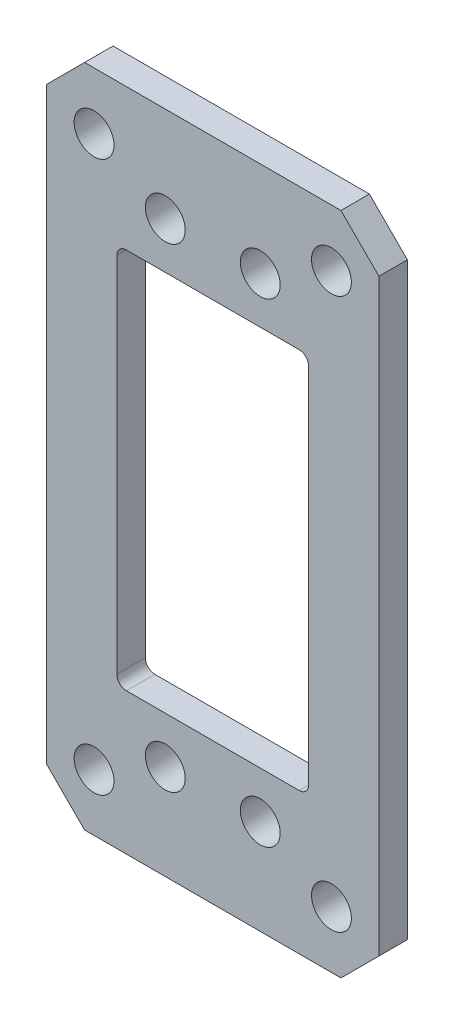
ISO-10303-21;
HEADER;
FILE_DESCRIPTION(('STEP AP214'),'2;1');
FILE_NAME('part.step','',(''),(''),'','','');
FILE_SCHEMA(('AUTOMOTIVE_DESIGN { 1 0 10303 214 1 1 1 1 }'));
ENDSEC;
DATA;
#1=APPLICATION_CONTEXT('core data for automotive mechanical design processes');
#2=APPLICATION_PROTOCOL_DEFINITION('international standard','automotive_design',2000,#1);
#3=PRODUCT_CONTEXT('',#1,'mechanical');
#4=PRODUCT('Part','Part','',(#3));
#5=PRODUCT_RELATED_PRODUCT_CATEGORY('part','',(#4));
#6=PRODUCT_DEFINITION_FORMATION('','',#4);
#7=PRODUCT_DEFINITION_CONTEXT('part definition',#1,'design');
#8=PRODUCT_DEFINITION('design','',#6,#7);
#9=PRODUCT_DEFINITION_SHAPE('','',#8);
#10=(LENGTH_UNIT() NAMED_UNIT(*) SI_UNIT(.MILLI.,.METRE.));
#11=(NAMED_UNIT(*) PLANE_ANGLE_UNIT() SI_UNIT($,.RADIAN.));
#12=(NAMED_UNIT(*) SI_UNIT($,.STERADIAN.) SOLID_ANGLE_UNIT());
#13=UNCERTAINTY_MEASURE_WITH_UNIT(LENGTH_MEASURE(1.E-05),#10,'distance_accuracy_value','');
#14=(GEOMETRIC_REPRESENTATION_CONTEXT(3) GLOBAL_UNCERTAINTY_ASSIGNED_CONTEXT((#13)) GLOBAL_UNIT_ASSIGNED_CONTEXT((#10,
#11,#12)) REPRESENTATION_CONTEXT('',''));
#15=CARTESIAN_POINT('',(0.,0.,0.));
#16=DIRECTION('',(0.,0.,1.));
#17=DIRECTION('',(1.,0.,0.));
#18=AXIS2_PLACEMENT_3D('',#15,#16,#17);
#19=CARTESIAN_POINT('',(5.,25.,0.));
#20=DIRECTION('',(0.,0.,1.));
#21=DIRECTION('',(1.,0.,0.));
#22=AXIS2_PLACEMENT_3D('',#19,#20,#21);
#23=CYLINDRICAL_SURFACE('',#22,2.1);
#24=CARTESIAN_POINT('',(5.,25.,0.));
#25=DIRECTION('',(0.,0.,1.));
#26=DIRECTION('',(1.,0.,0.));
#27=AXIS2_PLACEMENT_3D('',#24,#25,#26);
#28=CIRCLE('',#27,2.1);
#29=CARTESIAN_POINT('',(7.1,25.,0.));
#30=VERTEX_POINT('',#29);
#31=EDGE_CURVE('E221',#30,#30,#28,.T.);
#32=ORIENTED_EDGE('',*,*,#31,.F.);
#33=EDGE_LOOP('',(#32));
#34=FACE_BOUND('',#33,.T.);
#35=CARTESIAN_POINT('',(5.,25.,3.));
#36=DIRECTION('',(0.,0.,-1.));
#37=DIRECTION('',(-1.,0.,0.));
#38=AXIS2_PLACEMENT_3D('',#35,#36,#37);
#39=CIRCLE('',#38,2.1);
#40=CARTESIAN_POINT('',(2.9,25.,3.));
#41=VERTEX_POINT('',#40);
#42=EDGE_CURVE('E224',#41,#41,#39,.T.);
#43=ORIENTED_EDGE('',*,*,#42,.F.);
#44=EDGE_LOOP('',(#43));
#45=FACE_BOUND('',#44,.T.);
#46=ADVANCED_FACE('F39',(#34,#45),#23,.F.);
#47=CARTESIAN_POINT('',(-5.,25.,0.));
#48=DIRECTION('',(0.,0.,1.));
#49=DIRECTION('',(1.,0.,0.));
#50=AXIS2_PLACEMENT_3D('',#47,#48,#49);
#51=CYLINDRICAL_SURFACE('',#50,2.1);
#52=CARTESIAN_POINT('',(-5.,25.,0.));
#53=DIRECTION('',(0.,0.,1.));
#54=DIRECTION('',(1.,0.,0.));
#55=AXIS2_PLACEMENT_3D('',#52,#53,#54);
#56=CIRCLE('',#55,2.1);
#57=CARTESIAN_POINT('',(-2.9,25.,0.));
#58=VERTEX_POINT('',#57);
#59=EDGE_CURVE('E215',#58,#58,#56,.T.);
#60=ORIENTED_EDGE('',*,*,#59,.F.);
#61=EDGE_LOOP('',(#60));
#62=FACE_BOUND('',#61,.T.);
#63=CARTESIAN_POINT('',(-5.,25.,3.));
#64=DIRECTION('',(0.,0.,-1.));
#65=DIRECTION('',(-1.,0.,0.));
#66=AXIS2_PLACEMENT_3D('',#63,#64,#65);
#67=CIRCLE('',#66,2.1);
#68=CARTESIAN_POINT('',(-7.1,25.,3.));
#69=VERTEX_POINT('',#68);
#70=EDGE_CURVE('E218',#69,#69,#67,.T.);
#71=ORIENTED_EDGE('',*,*,#70,.F.);
#72=EDGE_LOOP('',(#71));
#73=FACE_BOUND('',#72,.T.);
#74=ADVANCED_FACE('F328',(#62,#73),#51,.F.);
#75=CARTESIAN_POINT('',(17.5,-35.,3.));
#76=DIRECTION('',(-1.,0.,0.));
#77=DIRECTION('',(0.,0.,1.));
#78=AXIS2_PLACEMENT_3D('',#75,#76,#77);
#79=PLANE('',#78);
#80=DIRECTION('',(0.,1.,0.));
#81=VECTOR('',#80,1.);
#82=CARTESIAN_POINT('',(17.5,-35.,3.));
#83=LINE('',#82,#81);
#84=CARTESIAN_POINT('',(17.5,-31.,3.));
#85=VERTEX_POINT('',#84);
#86=CARTESIAN_POINT('',(17.5,31.,3.));
#87=VERTEX_POINT('',#86);
#88=EDGE_CURVE('E179',#85,#87,#83,.T.);
#89=ORIENTED_EDGE('',*,*,#88,.F.);
#90=DIRECTION('',(0.,0.,-1.));
#91=VECTOR('',#90,1.);
#92=CARTESIAN_POINT('',(17.5,-31.,3.));
#93=LINE('',#92,#91);
#94=CARTESIAN_POINT('',(17.5,-31.,0.));
#95=VERTEX_POINT('',#94);
#96=EDGE_CURVE('E207',#85,#95,#93,.T.);
#97=ORIENTED_EDGE('',*,*,#96,.T.);
#98=DIRECTION('',(0.,1.,0.));
#99=VECTOR('',#98,1.);
#100=CARTESIAN_POINT('',(17.5,-35.,0.));
#101=LINE('',#100,#99);
#102=CARTESIAN_POINT('',(17.5,31.,0.));
#103=VERTEX_POINT('',#102);
#104=EDGE_CURVE('E286',#95,#103,#101,.T.);
#105=ORIENTED_EDGE('',*,*,#104,.T.);
#106=DIRECTION('',(0.,0.,1.));
#107=VECTOR('',#106,1.);
#108=CARTESIAN_POINT('',(17.5,31.,3.));
#109=LINE('',#108,#107);
#110=EDGE_CURVE('E205',#103,#87,#109,.T.);
#111=ORIENTED_EDGE('',*,*,#110,.T.);
#112=EDGE_LOOP('',(#89,#97,#105,#111));
#113=FACE_BOUND('',#112,.T.);
#114=ADVANCED_FACE('F325',(#113),#79,.F.);
#115=CARTESIAN_POINT('',(-17.5,35.,3.));
#116=DIRECTION('',(0.,-1.,0.));
#117=DIRECTION('',(0.,0.,-1.));
#118=AXIS2_PLACEMENT_3D('',#115,#116,#117);
#119=PLANE('',#118);
#120=DIRECTION('',(-1.,0.,0.));
#121=VECTOR('',#120,1.);
#122=CARTESIAN_POINT('',(-17.5,35.,3.));
#123=LINE('',#122,#121);
#124=CARTESIAN_POINT('',(13.5,35.,3.));
#125=VERTEX_POINT('',#124);
#126=CARTESIAN_POINT('',(-13.5,35.,3.));
#127=VERTEX_POINT('',#126);
#128=EDGE_CURVE('E183',#125,#127,#123,.T.);
#129=ORIENTED_EDGE('',*,*,#128,.F.);
#130=DIRECTION('',(0.,0.,-1.));
#131=VECTOR('',#130,1.);
#132=CARTESIAN_POINT('',(13.5,35.,3.));
#133=LINE('',#132,#131);
#134=CARTESIAN_POINT('',(13.5,35.,0.));
#135=VERTEX_POINT('',#134);
#136=EDGE_CURVE('E212',#125,#135,#133,.T.);
#137=ORIENTED_EDGE('',*,*,#136,.T.);
#138=DIRECTION('',(-1.,0.,0.));
#139=VECTOR('',#138,1.);
#140=CARTESIAN_POINT('',(-17.5,35.,0.));
#141=LINE('',#140,#139);
#142=CARTESIAN_POINT('',(-13.5,35.,0.));
#143=VERTEX_POINT('',#142);
#144=EDGE_CURVE('E185',#135,#143,#141,.T.);
#145=ORIENTED_EDGE('',*,*,#144,.T.);
#146=DIRECTION('',(0.,0.,1.));
#147=VECTOR('',#146,1.);
#148=CARTESIAN_POINT('',(-13.5,35.,3.));
#149=LINE('',#148,#147);
#150=EDGE_CURVE('E210',#143,#127,#149,.T.);
#151=ORIENTED_EDGE('',*,*,#150,.T.);
#152=EDGE_LOOP('',(#129,#137,#145,#151));
#153=FACE_BOUND('',#152,.T.);
#154=ADVANCED_FACE('F306',(#153),#119,.F.);
#155=CARTESIAN_POINT('',(-17.5,-35.,3.));
#156=DIRECTION('',(1.,0.,0.));
#157=DIRECTION('',(0.,0.,-1.));
#158=AXIS2_PLACEMENT_3D('',#155,#156,#157);
#159=PLANE('',#158);
#160=DIRECTION('',(0.,-1.,0.));
#161=VECTOR('',#160,1.);
#162=CARTESIAN_POINT('',(-17.5,-35.,0.));
#163=LINE('',#162,#161);
#164=CARTESIAN_POINT('',(-17.5,31.,0.));
#165=VERTEX_POINT('',#164);
#166=CARTESIAN_POINT('',(-17.5,-31.,0.));
#167=VERTEX_POINT('',#166);
#168=EDGE_CURVE('E180',#165,#167,#163,.T.);
#169=ORIENTED_EDGE('',*,*,#168,.T.);
#170=DIRECTION('',(0.,0.,1.));
#171=VECTOR('',#170,1.);
#172=CARTESIAN_POINT('',(-17.5,-31.,3.));
#173=LINE('',#172,#171);
#174=CARTESIAN_POINT('',(-17.5,-31.,3.));
#175=VERTEX_POINT('',#174);
#176=EDGE_CURVE('E157',#167,#175,#173,.T.);
#177=ORIENTED_EDGE('',*,*,#176,.T.);
#178=DIRECTION('',(0.,-1.,0.));
#179=VECTOR('',#178,1.);
#180=CARTESIAN_POINT('',(-17.5,-35.,3.));
#181=LINE('',#180,#179);
#182=CARTESIAN_POINT('',(-17.5,31.,3.));
#183=VERTEX_POINT('',#182);
#184=EDGE_CURVE('E296',#183,#175,#181,.T.);
#185=ORIENTED_EDGE('',*,*,#184,.F.);
#186=DIRECTION('',(0.,0.,-1.));
#187=VECTOR('',#186,1.);
#188=CARTESIAN_POINT('',(-17.5,31.,3.));
#189=LINE('',#188,#187);
#190=EDGE_CURVE('E162',#183,#165,#189,.T.);
#191=ORIENTED_EDGE('',*,*,#190,.T.);
#192=EDGE_LOOP('',(#169,#177,#185,#191));
#193=FACE_BOUND('',#192,.T.);
#194=ADVANCED_FACE('F317',(#193),#159,.F.);
#195=CARTESIAN_POINT('',(-17.5,-35.,3.));
#196=DIRECTION('',(0.,1.,0.));
#197=DIRECTION('',(0.,0.,1.));
#198=AXIS2_PLACEMENT_3D('',#195,#196,#197);
#199=PLANE('',#198);
#200=DIRECTION('',(1.,0.,0.));
#201=VECTOR('',#200,1.);
#202=CARTESIAN_POINT('',(-17.5,-35.,3.));
#203=LINE('',#202,#201);
#204=CARTESIAN_POINT('',(-13.5,-35.,3.));
#205=VERTEX_POINT('',#204);
#206=CARTESIAN_POINT('',(13.5,-35.,3.));
#207=VERTEX_POINT('',#206);
#208=EDGE_CURVE('E172',#205,#207,#203,.T.);
#209=ORIENTED_EDGE('',*,*,#208,.F.);
#210=DIRECTION('',(0.,0.,-1.));
#211=VECTOR('',#210,1.);
#212=CARTESIAN_POINT('',(-13.5,-35.,3.));
#213=LINE('',#212,#211);
#214=CARTESIAN_POINT('',(-13.5,-35.,0.));
#215=VERTEX_POINT('',#214);
#216=EDGE_CURVE('E156',#205,#215,#213,.T.);
#217=ORIENTED_EDGE('',*,*,#216,.T.);
#218=DIRECTION('',(1.,0.,0.));
#219=VECTOR('',#218,1.);
#220=CARTESIAN_POINT('',(-17.5,-35.,0.));
#221=LINE('',#220,#219);
#222=CARTESIAN_POINT('',(13.5,-35.,0.));
#223=VERTEX_POINT('',#222);
#224=EDGE_CURVE('E169',#215,#223,#221,.T.);
#225=ORIENTED_EDGE('',*,*,#224,.T.);
#226=DIRECTION('',(0.,0.,1.));
#227=VECTOR('',#226,1.);
#228=CARTESIAN_POINT('',(13.5,-35.,3.));
#229=LINE('',#228,#227);
#230=EDGE_CURVE('E174',#223,#207,#229,.T.);
#231=ORIENTED_EDGE('',*,*,#230,.T.);
#232=EDGE_LOOP('',(#209,#217,#225,#231));
#233=FACE_BOUND('',#232,.T.);
#234=ADVANCED_FACE('F168',(#233),#199,.F.);
#235=CARTESIAN_POINT('',(0.,0.,3.));
#236=DIRECTION('',(0.,0.,-1.));
#237=DIRECTION('',(-1.,0.,0.));
#238=AXIS2_PLACEMENT_3D('',#235,#236,#237);
#239=PLANE('',#238);
#240=CARTESIAN_POINT('',(5.,-25.,3.));
#241=DIRECTION('',(0.,0.,-1.));
#242=DIRECTION('',(-1.,0.,0.));
#243=AXIS2_PLACEMENT_3D('',#240,#241,#242);
#244=CIRCLE('',#243,2.1);
#245=CARTESIAN_POINT('',(2.9,-25.,3.));
#246=VERTEX_POINT('',#245);
#247=EDGE_CURVE('E435',#246,#246,#244,.T.);
#248=ORIENTED_EDGE('',*,*,#247,.T.);
#249=EDGE_LOOP('',(#248));
#250=FACE_BOUND('',#249,.T.);
#251=CARTESIAN_POINT('',(-5.,-25.,3.));
#252=DIRECTION('',(0.,0.,-1.));
#253=DIRECTION('',(-1.,0.,0.));
#254=AXIS2_PLACEMENT_3D('',#251,#252,#253);
#255=CIRCLE('',#254,2.1);
#256=CARTESIAN_POINT('',(-7.1,-25.,3.));
#257=VERTEX_POINT('',#256);
#258=EDGE_CURVE('E424',#257,#257,#255,.T.);
#259=ORIENTED_EDGE('',*,*,#258,.T.);
#260=EDGE_LOOP('',(#259));
#261=FACE_BOUND('',#260,.T.);
#262=CARTESIAN_POINT('',(12.5,-29.,3.));
#263=DIRECTION('',(0.,0.,-1.));
#264=DIRECTION('',(-1.,0.,0.));
#265=AXIS2_PLACEMENT_3D('',#262,#263,#264);
#266=CIRCLE('',#265,2.1);
#267=CARTESIAN_POINT('',(10.4,-29.,3.));
#268=VERTEX_POINT('',#267);
#269=EDGE_CURVE('E416',#268,#268,#266,.T.);
#270=ORIENTED_EDGE('',*,*,#269,.T.);
#271=EDGE_LOOP('',(#270));
#272=FACE_BOUND('',#271,.T.);
#273=CARTESIAN_POINT('',(-12.5,29.,3.));
#274=DIRECTION('',(0.,0.,-1.));
#275=DIRECTION('',(-1.,0.,0.));
#276=AXIS2_PLACEMENT_3D('',#273,#274,#275);
#277=CIRCLE('',#276,2.1);
#278=CARTESIAN_POINT('',(-14.6,29.,3.));
#279=VERTEX_POINT('',#278);
#280=EDGE_CURVE('E428',#279,#279,#277,.T.);
#281=ORIENTED_EDGE('',*,*,#280,.T.);
#282=EDGE_LOOP('',(#281));
#283=FACE_BOUND('',#282,.T.);
#284=CARTESIAN_POINT('',(-12.5,-29.,3.));
#285=DIRECTION('',(0.,0.,-1.));
#286=DIRECTION('',(-1.,0.,0.));
#287=AXIS2_PLACEMENT_3D('',#284,#285,#286);
#288=CIRCLE('',#287,2.1);
#289=CARTESIAN_POINT('',(-14.6,-29.,3.));
#290=VERTEX_POINT('',#289);
#291=EDGE_CURVE('E423',#290,#290,#288,.T.);
#292=ORIENTED_EDGE('',*,*,#291,.T.);
#293=EDGE_LOOP('',(#292));
#294=FACE_BOUND('',#293,.T.);
#295=CARTESIAN_POINT('',(12.5,29.,3.));
#296=DIRECTION('',(0.,0.,-1.));
#297=DIRECTION('',(-1.,0.,0.));
#298=AXIS2_PLACEMENT_3D('',#295,#296,#297);
#299=CIRCLE('',#298,2.1);
#300=CARTESIAN_POINT('',(10.4,29.,3.));
#301=VERTEX_POINT('',#300);
#302=EDGE_CURVE('E270',#301,#301,#299,.T.);
#303=ORIENTED_EDGE('',*,*,#302,.T.);
#304=EDGE_LOOP('',(#303));
#305=FACE_BOUND('',#304,.T.);
#306=DIRECTION('',(0.,-1.,0.));
#307=VECTOR('',#306,1.);
#308=CARTESIAN_POINT('',(10.1,-20.1,3.));
#309=LINE('',#308,#307);
#310=CARTESIAN_POINT('',(10.1,19.1,3.));
#311=VERTEX_POINT('',#310);
#312=CARTESIAN_POINT('',(10.1,-19.1,3.));
#313=VERTEX_POINT('',#312);
#314=EDGE_CURVE('E275',#311,#313,#309,.T.);
#315=ORIENTED_EDGE('',*,*,#314,.T.);
#316=CARTESIAN_POINT('',(9.1,-19.1,3.));
#317=DIRECTION('',(0.,0.,-1.));
#318=DIRECTION('',(-1.,0.,0.));
#319=AXIS2_PLACEMENT_3D('',#316,#317,#318);
#320=CIRCLE('',#319,1.);
#321=CARTESIAN_POINT('',(9.1,-20.1,3.));
#322=VERTEX_POINT('',#321);
#323=EDGE_CURVE('E248',#313,#322,#320,.T.);
#324=ORIENTED_EDGE('',*,*,#323,.T.);
#325=DIRECTION('',(-1.,0.,0.));
#326=VECTOR('',#325,1.);
#327=CARTESIAN_POINT('',(10.1,-20.1,3.));
#328=LINE('',#327,#326);
#329=CARTESIAN_POINT('',(-9.1,-20.1,3.));
#330=VERTEX_POINT('',#329);
#331=EDGE_CURVE('E279',#322,#330,#328,.T.);
#332=ORIENTED_EDGE('',*,*,#331,.T.);
#333=CARTESIAN_POINT('',(-9.1,-19.1,3.));
#334=DIRECTION('',(0.,0.,-1.));
#335=DIRECTION('',(-1.,0.,0.));
#336=AXIS2_PLACEMENT_3D('',#333,#334,#335);
#337=CIRCLE('',#336,1.);
#338=CARTESIAN_POINT('',(-10.1,-19.1,3.));
#339=VERTEX_POINT('',#338);
#340=EDGE_CURVE('E252',#330,#339,#337,.T.);
#341=ORIENTED_EDGE('',*,*,#340,.T.);
#342=DIRECTION('',(0.,1.,0.));
#343=VECTOR('',#342,1.);
#344=CARTESIAN_POINT('',(-10.1,-20.1,3.));
#345=LINE('',#344,#343);
#346=CARTESIAN_POINT('',(-10.1,19.1,3.));
#347=VERTEX_POINT('',#346);
#348=EDGE_CURVE('E276',#339,#347,#345,.T.);
#349=ORIENTED_EDGE('',*,*,#348,.T.);
#350=CARTESIAN_POINT('',(-9.1,19.1,3.));
#351=DIRECTION('',(0.,0.,-1.));
#352=DIRECTION('',(-1.,0.,0.));
#353=AXIS2_PLACEMENT_3D('',#350,#351,#352);
#354=CIRCLE('',#353,1.);
#355=CARTESIAN_POINT('',(-9.1,20.1,3.));
#356=VERTEX_POINT('',#355);
#357=EDGE_CURVE('E11',#347,#356,#354,.T.);
#358=ORIENTED_EDGE('',*,*,#357,.T.);
#359=DIRECTION('',(1.,0.,0.));
#360=VECTOR('',#359,1.);
#361=CARTESIAN_POINT('',(10.1,20.1,3.));
#362=LINE('',#361,#360);
#363=CARTESIAN_POINT('',(9.1,20.1,3.));
#364=VERTEX_POINT('',#363);
#365=EDGE_CURVE('E273',#356,#364,#362,.T.);
#366=ORIENTED_EDGE('',*,*,#365,.T.);
#367=CARTESIAN_POINT('',(9.1,19.1,3.));
#368=DIRECTION('',(0.,0.,-1.));
#369=DIRECTION('',(-1.,0.,0.));
#370=AXIS2_PLACEMENT_3D('',#367,#368,#369);
#371=CIRCLE('',#370,1.);
#372=EDGE_CURVE('E256',#364,#311,#371,.T.);
#373=ORIENTED_EDGE('',*,*,#372,.T.);
#374=EDGE_LOOP('',(#315,#324,#332,#341,#349,#358,#366,#373));
#375=FACE_BOUND('',#374,.T.);
#376=ORIENTED_EDGE('',*,*,#184,.T.);
#377=DIRECTION('',(-0.707106781186547,0.707106781186549,0.));
#378=VECTOR('',#377,1.);
#379=CARTESIAN_POINT('',(-13.5,-35.,3.));
#380=LINE('',#379,#378);
#381=EDGE_CURVE('E203',#175,#205,#380,.F.);
#382=ORIENTED_EDGE('',*,*,#381,.T.);
#383=ORIENTED_EDGE('',*,*,#208,.T.);
#384=DIRECTION('',(-0.707106781186548,-0.707106781186547,0.));
#385=VECTOR('',#384,1.);
#386=CARTESIAN_POINT('',(17.5,-31.,3.));
#387=LINE('',#386,#385);
#388=EDGE_CURVE('E201',#207,#85,#387,.F.);
#389=ORIENTED_EDGE('',*,*,#388,.T.);
#390=ORIENTED_EDGE('',*,*,#88,.T.);
#391=DIRECTION('',(0.707106781186547,-0.707106781186548,0.));
#392=VECTOR('',#391,1.);
#393=CARTESIAN_POINT('',(13.5,35.,3.));
#394=LINE('',#393,#392);
#395=EDGE_CURVE('E199',#87,#125,#394,.F.);
#396=ORIENTED_EDGE('',*,*,#395,.T.);
#397=ORIENTED_EDGE('',*,*,#128,.T.);
#398=DIRECTION('',(0.707106781186548,0.707106781186547,0.));
#399=VECTOR('',#398,1.);
#400=CARTESIAN_POINT('',(-17.5,31.,3.));
#401=LINE('',#400,#399);
#402=EDGE_CURVE('E197',#127,#183,#401,.F.);
#403=ORIENTED_EDGE('',*,*,#402,.T.);
#404=EDGE_LOOP('',(#376,#382,#383,#389,#390,#396,#397,#403));
#405=FACE_BOUND('',#404,.T.);
#406=ORIENTED_EDGE('',*,*,#70,.T.);
#407=EDGE_LOOP('',(#406));
#408=FACE_BOUND('',#407,.T.);
#409=ORIENTED_EDGE('',*,*,#42,.T.);
#410=EDGE_LOOP('',(#409));
#411=FACE_BOUND('',#410,.T.);
#412=ADVANCED_FACE('F314',(#250,#261,#272,#283,#294,#305,#375,#405,#408,#411),#239,.F.);
#413=CARTESIAN_POINT('',(0.,0.,0.));
#414=DIRECTION('',(0.,0.,-1.));
#415=DIRECTION('',(-1.,0.,0.));
#416=AXIS2_PLACEMENT_3D('',#413,#414,#415);
#417=PLANE('',#416);
#418=CARTESIAN_POINT('',(5.,-25.,0.));
#419=DIRECTION('',(0.,0.,1.));
#420=DIRECTION('',(1.,0.,0.));
#421=AXIS2_PLACEMENT_3D('',#418,#419,#420);
#422=CIRCLE('',#421,2.1);
#423=CARTESIAN_POINT('',(7.1,-25.,0.));
#424=VERTEX_POINT('',#423);
#425=EDGE_CURVE('E395',#424,#424,#422,.T.);
#426=ORIENTED_EDGE('',*,*,#425,.T.);
#427=EDGE_LOOP('',(#426));
#428=FACE_BOUND('',#427,.T.);
#429=CARTESIAN_POINT('',(-5.,-25.,0.));
#430=DIRECTION('',(0.,0.,1.));
#431=DIRECTION('',(1.,0.,0.));
#432=AXIS2_PLACEMENT_3D('',#429,#430,#431);
#433=CIRCLE('',#432,2.1);
#434=CARTESIAN_POINT('',(-2.9,-25.,0.));
#435=VERTEX_POINT('',#434);
#436=EDGE_CURVE('E399',#435,#435,#433,.T.);
#437=ORIENTED_EDGE('',*,*,#436,.T.);
#438=EDGE_LOOP('',(#437));
#439=FACE_BOUND('',#438,.T.);
#440=CARTESIAN_POINT('',(12.5,-29.,0.));
#441=DIRECTION('',(0.,0.,-1.));
#442=DIRECTION('',(-1.,0.,0.));
#443=AXIS2_PLACEMENT_3D('',#440,#441,#442);
#444=CIRCLE('',#443,2.1);
#445=CARTESIAN_POINT('',(10.4,-29.,0.));
#446=VERTEX_POINT('',#445);
#447=EDGE_CURVE('E403',#446,#446,#444,.T.);
#448=ORIENTED_EDGE('',*,*,#447,.F.);
#449=EDGE_LOOP('',(#448));
#450=FACE_BOUND('',#449,.T.);
#451=CARTESIAN_POINT('',(-12.5,29.,0.));
#452=DIRECTION('',(0.,0.,-1.));
#453=DIRECTION('',(-1.,0.,0.));
#454=AXIS2_PLACEMENT_3D('',#451,#452,#453);
#455=CIRCLE('',#454,2.1);
#456=CARTESIAN_POINT('',(-14.6,29.,0.));
#457=VERTEX_POINT('',#456);
#458=EDGE_CURVE('E407',#457,#457,#455,.T.);
#459=ORIENTED_EDGE('',*,*,#458,.F.);
#460=EDGE_LOOP('',(#459));
#461=FACE_BOUND('',#460,.T.);
#462=CARTESIAN_POINT('',(-12.5,-29.,0.));
#463=DIRECTION('',(0.,0.,-1.));
#464=DIRECTION('',(-1.,0.,0.));
#465=AXIS2_PLACEMENT_3D('',#462,#463,#464);
#466=CIRCLE('',#465,2.1);
#467=CARTESIAN_POINT('',(-14.6,-29.,0.));
#468=VERTEX_POINT('',#467);
#469=EDGE_CURVE('E411',#468,#468,#466,.T.);
#470=ORIENTED_EDGE('',*,*,#469,.F.);
#471=EDGE_LOOP('',(#470));
#472=FACE_BOUND('',#471,.T.);
#473=CARTESIAN_POINT('',(12.5,29.,0.));
#474=DIRECTION('',(0.,0.,-1.));
#475=DIRECTION('',(-1.,0.,0.));
#476=AXIS2_PLACEMENT_3D('',#473,#474,#475);
#477=CIRCLE('',#476,2.1);
#478=CARTESIAN_POINT('',(10.4,29.,0.));
#479=VERTEX_POINT('',#478);
#480=EDGE_CURVE('E414',#479,#479,#477,.T.);
#481=ORIENTED_EDGE('',*,*,#480,.F.);
#482=EDGE_LOOP('',(#481));
#483=FACE_BOUND('',#482,.T.);
#484=DIRECTION('',(0.,1.,0.));
#485=VECTOR('',#484,1.);
#486=CARTESIAN_POINT('',(-10.1,-20.1,0.));
#487=LINE('',#486,#485);
#488=CARTESIAN_POINT('',(-10.1,-19.1,0.));
#489=VERTEX_POINT('',#488);
#490=CARTESIAN_POINT('',(-10.1,19.1,0.));
#491=VERTEX_POINT('',#490);
#492=EDGE_CURVE('E261',#489,#491,#487,.T.);
#493=ORIENTED_EDGE('',*,*,#492,.F.);
#494=CARTESIAN_POINT('',(-9.1,-19.1,0.));
#495=DIRECTION('',(0.,0.,-1.));
#496=DIRECTION('',(-1.,0.,0.));
#497=AXIS2_PLACEMENT_3D('',#494,#495,#496);
#498=CIRCLE('',#497,1.);
#499=CARTESIAN_POINT('',(-9.1,-20.1,0.));
#500=VERTEX_POINT('',#499);
#501=EDGE_CURVE('E250',#489,#500,#498,.F.);
#502=ORIENTED_EDGE('',*,*,#501,.T.);
#503=DIRECTION('',(-1.,0.,0.));
#504=VECTOR('',#503,1.);
#505=CARTESIAN_POINT('',(10.1,-20.1,0.));
#506=LINE('',#505,#504);
#507=CARTESIAN_POINT('',(9.1,-20.1,0.));
#508=VERTEX_POINT('',#507);
#509=EDGE_CURVE('E281',#508,#500,#506,.T.);
#510=ORIENTED_EDGE('',*,*,#509,.F.);
#511=CARTESIAN_POINT('',(9.1,-19.1,0.));
#512=DIRECTION('',(0.,0.,-1.));
#513=DIRECTION('',(-1.,0.,0.));
#514=AXIS2_PLACEMENT_3D('',#511,#512,#513);
#515=CIRCLE('',#514,1.);
#516=CARTESIAN_POINT('',(10.1,-19.1,0.));
#517=VERTEX_POINT('',#516);
#518=EDGE_CURVE('E246',#508,#517,#515,.F.);
#519=ORIENTED_EDGE('',*,*,#518,.T.);
#520=DIRECTION('',(0.,-1.,0.));
#521=VECTOR('',#520,1.);
#522=CARTESIAN_POINT('',(10.1,-20.1,0.));
#523=LINE('',#522,#521);
#524=CARTESIAN_POINT('',(10.1,19.1,0.));
#525=VERTEX_POINT('',#524);
#526=EDGE_CURVE('E289',#525,#517,#523,.T.);
#527=ORIENTED_EDGE('',*,*,#526,.F.);
#528=CARTESIAN_POINT('',(9.1,19.1,0.));
#529=DIRECTION('',(0.,0.,-1.));
#530=DIRECTION('',(-1.,0.,0.));
#531=AXIS2_PLACEMENT_3D('',#528,#529,#530);
#532=CIRCLE('',#531,1.);
#533=CARTESIAN_POINT('',(9.1,20.1,0.));
#534=VERTEX_POINT('',#533);
#535=EDGE_CURVE('E254',#525,#534,#532,.F.);
#536=ORIENTED_EDGE('',*,*,#535,.T.);
#537=DIRECTION('',(1.,0.,0.));
#538=VECTOR('',#537,1.);
#539=CARTESIAN_POINT('',(10.1,20.1,0.));
#540=LINE('',#539,#538);
#541=CARTESIAN_POINT('',(-9.1,20.1,0.));
#542=VERTEX_POINT('',#541);
#543=EDGE_CURVE('E262',#542,#534,#540,.T.);
#544=ORIENTED_EDGE('',*,*,#543,.F.);
#545=CARTESIAN_POINT('',(-9.1,19.1,0.));
#546=DIRECTION('',(0.,0.,-1.));
#547=DIRECTION('',(-1.,0.,0.));
#548=AXIS2_PLACEMENT_3D('',#545,#546,#547);
#549=CIRCLE('',#548,1.);
#550=EDGE_CURVE('E47',#542,#491,#549,.F.);
#551=ORIENTED_EDGE('',*,*,#550,.T.);
#552=EDGE_LOOP('',(#493,#502,#510,#519,#527,#536,#544,#551));
#553=FACE_BOUND('',#552,.T.);
#554=ORIENTED_EDGE('',*,*,#224,.F.);
#555=DIRECTION('',(0.707106781186547,-0.707106781186549,0.));
#556=VECTOR('',#555,1.);
#557=CARTESIAN_POINT('',(-24.25,-24.25,0.));
#558=LINE('',#557,#556);
#559=EDGE_CURVE('E152',#215,#167,#558,.F.);
#560=ORIENTED_EDGE('',*,*,#559,.T.);
#561=ORIENTED_EDGE('',*,*,#168,.F.);
#562=DIRECTION('',(-0.707106781186548,-0.707106781186547,0.));
#563=VECTOR('',#562,1.);
#564=CARTESIAN_POINT('',(-24.25,24.25,0.));
#565=LINE('',#564,#563);
#566=EDGE_CURVE('E173',#165,#143,#565,.F.);
#567=ORIENTED_EDGE('',*,*,#566,.T.);
#568=ORIENTED_EDGE('',*,*,#144,.F.);
#569=DIRECTION('',(-0.707106781186547,0.707106781186548,0.));
#570=VECTOR('',#569,1.);
#571=CARTESIAN_POINT('',(24.25,24.25,0.));
#572=LINE('',#571,#570);
#573=EDGE_CURVE('E191',#135,#103,#572,.F.);
#574=ORIENTED_EDGE('',*,*,#573,.T.);
#575=ORIENTED_EDGE('',*,*,#104,.F.);
#576=DIRECTION('',(0.707106781186548,0.707106781186547,0.));
#577=VECTOR('',#576,1.);
#578=CARTESIAN_POINT('',(24.25,-24.25,0.));
#579=LINE('',#578,#577);
#580=EDGE_CURVE('E163',#95,#223,#579,.F.);
#581=ORIENTED_EDGE('',*,*,#580,.T.);
#582=EDGE_LOOP('',(#554,#560,#561,#567,#568,#574,#575,#581));
#583=FACE_BOUND('',#582,.T.);
#584=ORIENTED_EDGE('',*,*,#59,.T.);
#585=EDGE_LOOP('',(#584));
#586=FACE_BOUND('',#585,.T.);
#587=ORIENTED_EDGE('',*,*,#31,.T.);
#588=EDGE_LOOP('',(#587));
#589=FACE_BOUND('',#588,.T.);
#590=ADVANCED_FACE('F176',(#428,#439,#450,#461,#472,#483,#553,#583,#586,#589),#417,.T.);
#591=CARTESIAN_POINT('',(-13.5,-35.,3.));
#592=DIRECTION('',(0.707106781186549,0.707106781186547,0.));
#593=DIRECTION('',(0.,0.,-1.));
#594=AXIS2_PLACEMENT_3D('',#591,#592,#593);
#595=PLANE('',#594);
#596=ORIENTED_EDGE('',*,*,#381,.F.);
#597=ORIENTED_EDGE('',*,*,#176,.F.);
#598=ORIENTED_EDGE('',*,*,#559,.F.);
#599=ORIENTED_EDGE('',*,*,#216,.F.);
#600=EDGE_LOOP('',(#596,#597,#598,#599));
#601=FACE_BOUND('',#600,.T.);
#602=ADVANCED_FACE('F155',(#601),#595,.F.);
#603=CARTESIAN_POINT('',(17.5,-31.,3.));
#604=DIRECTION('',(-0.707106781186547,0.707106781186548,0.));
#605=DIRECTION('',(0.,0.,-1.));
#606=AXIS2_PLACEMENT_3D('',#603,#604,#605);
#607=PLANE('',#606);
#608=ORIENTED_EDGE('',*,*,#388,.F.);
#609=ORIENTED_EDGE('',*,*,#230,.F.);
#610=ORIENTED_EDGE('',*,*,#580,.F.);
#611=ORIENTED_EDGE('',*,*,#96,.F.);
#612=EDGE_LOOP('',(#608,#609,#610,#611));
#613=FACE_BOUND('',#612,.T.);
#614=ADVANCED_FACE('F390',(#613),#607,.F.);
#615=CARTESIAN_POINT('',(13.5,35.,3.));
#616=DIRECTION('',(-0.707106781186548,-0.707106781186547,0.));
#617=DIRECTION('',(0.,0.,-1.));
#618=AXIS2_PLACEMENT_3D('',#615,#616,#617);
#619=PLANE('',#618);
#620=ORIENTED_EDGE('',*,*,#395,.F.);
#621=ORIENTED_EDGE('',*,*,#110,.F.);
#622=ORIENTED_EDGE('',*,*,#573,.F.);
#623=ORIENTED_EDGE('',*,*,#136,.F.);
#624=EDGE_LOOP('',(#620,#621,#622,#623));
#625=FACE_BOUND('',#624,.T.);
#626=ADVANCED_FACE('F583',(#625),#619,.F.);
#627=CARTESIAN_POINT('',(-17.5,31.,3.));
#628=DIRECTION('',(0.707106781186547,-0.707106781186548,0.));
#629=DIRECTION('',(0.,0.,-1.));
#630=AXIS2_PLACEMENT_3D('',#627,#628,#629);
#631=PLANE('',#630);
#632=ORIENTED_EDGE('',*,*,#402,.F.);
#633=ORIENTED_EDGE('',*,*,#150,.F.);
#634=ORIENTED_EDGE('',*,*,#566,.F.);
#635=ORIENTED_EDGE('',*,*,#190,.F.);
#636=EDGE_LOOP('',(#632,#633,#634,#635));
#637=FACE_BOUND('',#636,.T.);
#638=ADVANCED_FACE('F310',(#637),#631,.F.);
#639=CARTESIAN_POINT('',(-10.1,-20.1,3.));
#640=DIRECTION('',(-1.,0.,0.));
#641=DIRECTION('',(0.,0.,1.));
#642=AXIS2_PLACEMENT_3D('',#639,#640,#641);
#643=PLANE('',#642);
#644=ORIENTED_EDGE('',*,*,#348,.F.);
#645=DIRECTION('',(0.,0.,-1.));
#646=VECTOR('',#645,1.);
#647=CARTESIAN_POINT('',(-10.1,-19.1,0.));
#648=LINE('',#647,#646);
#649=EDGE_CURVE('E239',#339,#489,#648,.T.);
#650=ORIENTED_EDGE('',*,*,#649,.T.);
#651=ORIENTED_EDGE('',*,*,#492,.T.);
#652=DIRECTION('',(0.,0.,-1.));
#653=VECTOR('',#652,1.);
#654=CARTESIAN_POINT('',(-10.1,19.1,3.));
#655=LINE('',#654,#653);
#656=EDGE_CURVE('E237',#491,#347,#655,.F.);
#657=ORIENTED_EDGE('',*,*,#656,.T.);
#658=EDGE_LOOP('',(#644,#650,#651,#657));
#659=FACE_BOUND('',#658,.T.);
#660=ADVANCED_FACE('F268',(#659),#643,.F.);
#661=CARTESIAN_POINT('',(10.1,-20.1,3.));
#662=DIRECTION('',(0.,-1.,0.));
#663=DIRECTION('',(0.,0.,-1.));
#664=AXIS2_PLACEMENT_3D('',#661,#662,#663);
#665=PLANE('',#664);
#666=ORIENTED_EDGE('',*,*,#331,.F.);
#667=DIRECTION('',(0.,0.,-1.));
#668=VECTOR('',#667,1.);
#669=CARTESIAN_POINT('',(9.1,-20.1,0.));
#670=LINE('',#669,#668);
#671=EDGE_CURVE('E229',#322,#508,#670,.T.);
#672=ORIENTED_EDGE('',*,*,#671,.T.);
#673=ORIENTED_EDGE('',*,*,#509,.T.);
#674=DIRECTION('',(0.,0.,-1.));
#675=VECTOR('',#674,1.);
#676=CARTESIAN_POINT('',(-9.1,-20.1,3.));
#677=LINE('',#676,#675);
#678=EDGE_CURVE('E227',#500,#330,#677,.F.);
#679=ORIENTED_EDGE('',*,*,#678,.T.);
#680=EDGE_LOOP('',(#666,#672,#673,#679));
#681=FACE_BOUND('',#680,.T.);
#682=ADVANCED_FACE('F365',(#681),#665,.F.);
#683=CARTESIAN_POINT('',(10.1,-20.1,3.));
#684=DIRECTION('',(1.,0.,0.));
#685=DIRECTION('',(0.,0.,-1.));
#686=AXIS2_PLACEMENT_3D('',#683,#684,#685);
#687=PLANE('',#686);
#688=ORIENTED_EDGE('',*,*,#526,.T.);
#689=DIRECTION('',(0.,0.,-1.));
#690=VECTOR('',#689,1.);
#691=CARTESIAN_POINT('',(10.1,-19.1,3.));
#692=LINE('',#691,#690);
#693=EDGE_CURVE('E235',#517,#313,#692,.F.);
#694=ORIENTED_EDGE('',*,*,#693,.T.);
#695=ORIENTED_EDGE('',*,*,#314,.F.);
#696=DIRECTION('',(0.,0.,-1.));
#697=VECTOR('',#696,1.);
#698=CARTESIAN_POINT('',(10.1,19.1,0.));
#699=LINE('',#698,#697);
#700=EDGE_CURVE('E232',#311,#525,#699,.T.);
#701=ORIENTED_EDGE('',*,*,#700,.T.);
#702=EDGE_LOOP('',(#688,#694,#695,#701));
#703=FACE_BOUND('',#702,.T.);
#704=ADVANCED_FACE('F358',(#703),#687,.F.);
#705=CARTESIAN_POINT('',(10.1,20.1,3.));
#706=DIRECTION('',(0.,1.,0.));
#707=DIRECTION('',(0.,0.,1.));
#708=AXIS2_PLACEMENT_3D('',#705,#706,#707);
#709=PLANE('',#708);
#710=ORIENTED_EDGE('',*,*,#543,.T.);
#711=DIRECTION('',(0.,0.,-1.));
#712=VECTOR('',#711,1.);
#713=CARTESIAN_POINT('',(9.1,20.1,3.));
#714=LINE('',#713,#712);
#715=EDGE_CURVE('E54',#534,#364,#714,.F.);
#716=ORIENTED_EDGE('',*,*,#715,.T.);
#717=ORIENTED_EDGE('',*,*,#365,.F.);
#718=DIRECTION('',(0.,0.,-1.));
#719=VECTOR('',#718,1.);
#720=CARTESIAN_POINT('',(-9.1,20.1,0.));
#721=LINE('',#720,#719);
#722=EDGE_CURVE('E242',#356,#542,#721,.T.);
#723=ORIENTED_EDGE('',*,*,#722,.T.);
#724=EDGE_LOOP('',(#710,#716,#717,#723));
#725=FACE_BOUND('',#724,.T.);
#726=ADVANCED_FACE('F272',(#725),#709,.F.);
#727=CARTESIAN_POINT('',(12.5,29.,3.));
#728=DIRECTION('',(0.,0.,-1.));
#729=DIRECTION('',(-1.,0.,0.));
#730=AXIS2_PLACEMENT_3D('',#727,#728,#729);
#731=CYLINDRICAL_SURFACE('',#730,2.1);
#732=ORIENTED_EDGE('',*,*,#302,.F.);
#733=EDGE_LOOP('',(#732));
#734=FACE_BOUND('',#733,.T.);
#735=ORIENTED_EDGE('',*,*,#480,.T.);
#736=EDGE_LOOP('',(#735));
#737=FACE_BOUND('',#736,.T.);
#738=ADVANCED_FACE('F377',(#734,#737),#731,.F.);
#739=CARTESIAN_POINT('',(-12.5,-29.,3.));
#740=DIRECTION('',(0.,0.,-1.));
#741=DIRECTION('',(-1.,0.,0.));
#742=AXIS2_PLACEMENT_3D('',#739,#740,#741);
#743=CYLINDRICAL_SURFACE('',#742,2.1);
#744=ORIENTED_EDGE('',*,*,#291,.F.);
#745=EDGE_LOOP('',(#744));
#746=FACE_BOUND('',#745,.T.);
#747=ORIENTED_EDGE('',*,*,#469,.T.);
#748=EDGE_LOOP('',(#747));
#749=FACE_BOUND('',#748,.T.);
#750=ADVANCED_FACE('F457',(#746,#749),#743,.F.);
#751=CARTESIAN_POINT('',(-12.5,29.,3.));
#752=DIRECTION('',(0.,0.,-1.));
#753=DIRECTION('',(-1.,0.,0.));
#754=AXIS2_PLACEMENT_3D('',#751,#752,#753);
#755=CYLINDRICAL_SURFACE('',#754,2.1);
#756=ORIENTED_EDGE('',*,*,#280,.F.);
#757=EDGE_LOOP('',(#756));
#758=FACE_BOUND('',#757,.T.);
#759=ORIENTED_EDGE('',*,*,#458,.T.);
#760=EDGE_LOOP('',(#759));
#761=FACE_BOUND('',#760,.T.);
#762=ADVANCED_FACE('F454',(#758,#761),#755,.F.);
#763=CARTESIAN_POINT('',(12.5,-29.,3.));
#764=DIRECTION('',(0.,0.,-1.));
#765=DIRECTION('',(-1.,0.,0.));
#766=AXIS2_PLACEMENT_3D('',#763,#764,#765);
#767=CYLINDRICAL_SURFACE('',#766,2.1);
#768=ORIENTED_EDGE('',*,*,#269,.F.);
#769=EDGE_LOOP('',(#768));
#770=FACE_BOUND('',#769,.T.);
#771=ORIENTED_EDGE('',*,*,#447,.T.);
#772=EDGE_LOOP('',(#771));
#773=FACE_BOUND('',#772,.T.);
#774=ADVANCED_FACE('F448',(#770,#773),#767,.F.);
#775=CARTESIAN_POINT('',(-5.,-25.,0.));
#776=DIRECTION('',(0.,0.,1.));
#777=DIRECTION('',(1.,0.,0.));
#778=AXIS2_PLACEMENT_3D('',#775,#776,#777);
#779=CYLINDRICAL_SURFACE('',#778,2.1);
#780=ORIENTED_EDGE('',*,*,#436,.F.);
#781=EDGE_LOOP('',(#780));
#782=FACE_BOUND('',#781,.T.);
#783=ORIENTED_EDGE('',*,*,#258,.F.);
#784=EDGE_LOOP('',(#783));
#785=FACE_BOUND('',#784,.T.);
#786=ADVANCED_FACE('F442',(#782,#785),#779,.F.);
#787=CARTESIAN_POINT('',(5.,-25.,0.));
#788=DIRECTION('',(0.,0.,1.));
#789=DIRECTION('',(1.,0.,0.));
#790=AXIS2_PLACEMENT_3D('',#787,#788,#789);
#791=CYLINDRICAL_SURFACE('',#790,2.1);
#792=ORIENTED_EDGE('',*,*,#425,.F.);
#793=EDGE_LOOP('',(#792));
#794=FACE_BOUND('',#793,.T.);
#795=ORIENTED_EDGE('',*,*,#247,.F.);
#796=EDGE_LOOP('',(#795));
#797=FACE_BOUND('',#796,.T.);
#798=ADVANCED_FACE('F344',(#794,#797),#791,.F.);
#799=CARTESIAN_POINT('',(9.1,-19.1,3.));
#800=DIRECTION('',(0.,0.,1.));
#801=DIRECTION('',(1.,0.,0.));
#802=AXIS2_PLACEMENT_3D('',#799,#800,#801);
#803=CYLINDRICAL_SURFACE('',#802,1.);
#804=ORIENTED_EDGE('',*,*,#323,.F.);
#805=ORIENTED_EDGE('',*,*,#693,.F.);
#806=ORIENTED_EDGE('',*,*,#518,.F.);
#807=ORIENTED_EDGE('',*,*,#671,.F.);
#808=EDGE_LOOP('',(#804,#805,#806,#807));
#809=FACE_BOUND('',#808,.T.);
#810=ADVANCED_FACE('F340',(#809),#803,.F.);
#811=CARTESIAN_POINT('',(-9.1,-19.1,3.));
#812=DIRECTION('',(0.,0.,1.));
#813=DIRECTION('',(1.,0.,0.));
#814=AXIS2_PLACEMENT_3D('',#811,#812,#813);
#815=CYLINDRICAL_SURFACE('',#814,1.);
#816=ORIENTED_EDGE('',*,*,#340,.F.);
#817=ORIENTED_EDGE('',*,*,#678,.F.);
#818=ORIENTED_EDGE('',*,*,#501,.F.);
#819=ORIENTED_EDGE('',*,*,#649,.F.);
#820=EDGE_LOOP('',(#816,#817,#818,#819));
#821=FACE_BOUND('',#820,.T.);
#822=ADVANCED_FACE('F343',(#821),#815,.F.);
#823=CARTESIAN_POINT('',(9.1,19.1,3.));
#824=DIRECTION('',(0.,0.,1.));
#825=DIRECTION('',(1.,0.,0.));
#826=AXIS2_PLACEMENT_3D('',#823,#824,#825);
#827=CYLINDRICAL_SURFACE('',#826,1.);
#828=ORIENTED_EDGE('',*,*,#372,.F.);
#829=ORIENTED_EDGE('',*,*,#715,.F.);
#830=ORIENTED_EDGE('',*,*,#535,.F.);
#831=ORIENTED_EDGE('',*,*,#700,.F.);
#832=EDGE_LOOP('',(#828,#829,#830,#831));
#833=FACE_BOUND('',#832,.T.);
#834=ADVANCED_FACE('F347',(#833),#827,.F.);
#835=CARTESIAN_POINT('',(-9.1,19.1,3.));
#836=DIRECTION('',(0.,0.,1.));
#837=DIRECTION('',(1.,0.,0.));
#838=AXIS2_PLACEMENT_3D('',#835,#836,#837);
#839=CYLINDRICAL_SURFACE('',#838,1.);
#840=ORIENTED_EDGE('',*,*,#357,.F.);
#841=ORIENTED_EDGE('',*,*,#656,.F.);
#842=ORIENTED_EDGE('',*,*,#550,.F.);
#843=ORIENTED_EDGE('',*,*,#722,.F.);
#844=EDGE_LOOP('',(#840,#841,#842,#843));
#845=FACE_BOUND('',#844,.T.);
#846=ADVANCED_FACE('F41',(#845),#839,.F.);
#847=CLOSED_SHELL('',(#46,#74,#114,#154,#194,#234,#412,#590,#602,#614,#626,#638,#660,#682,#704,
#726,#738,#750,#762,#774,#786,#798,#810,#822,#834,#846));
#848=MANIFOLD_SOLID_BREP('B2',#847);
#849=ADVANCED_BREP_SHAPE_REPRESENTATION('',(#18,#848),#14);
#850=SHAPE_DEFINITION_REPRESENTATION(#9,#849);
ENDSEC;
END-ISO-10303-21;
